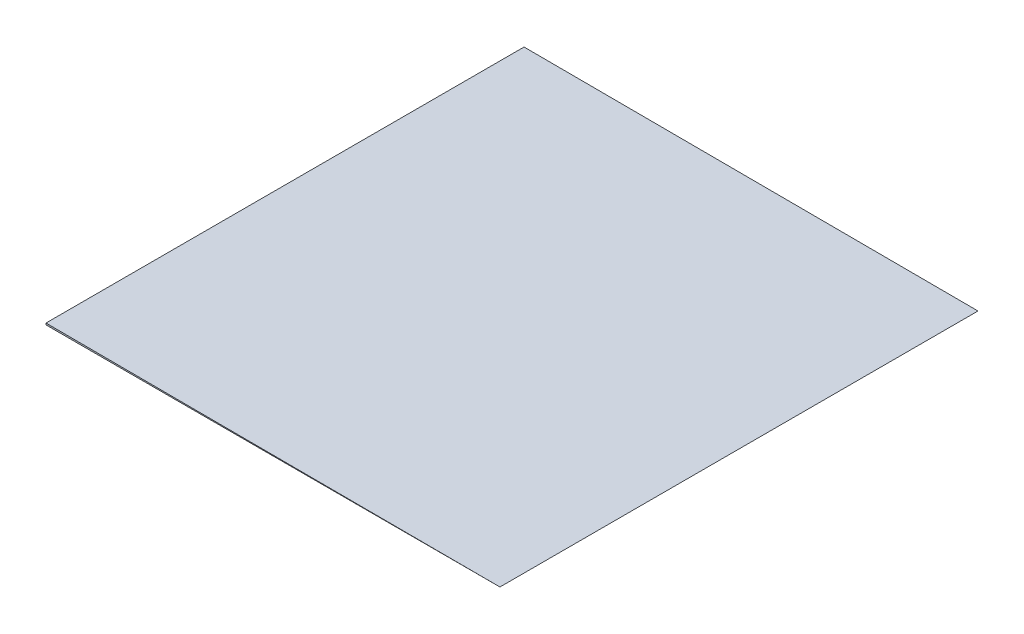
ISO-10303-21;
HEADER;
FILE_DESCRIPTION(('STEP AP214'),'2;1');
FILE_NAME('part.step','',(''),(''),'','','');
FILE_SCHEMA(('AUTOMOTIVE_DESIGN { 1 0 10303 214 1 1 1 1 }'));
ENDSEC;
DATA;
#1=APPLICATION_CONTEXT('core data for automotive mechanical design processes');
#2=APPLICATION_PROTOCOL_DEFINITION('international standard','automotive_design',2000,#1);
#3=PRODUCT_CONTEXT('',#1,'mechanical');
#4=PRODUCT('Part','Part','',(#3));
#5=PRODUCT_RELATED_PRODUCT_CATEGORY('part','',(#4));
#6=PRODUCT_DEFINITION_FORMATION('','',#4);
#7=PRODUCT_DEFINITION_CONTEXT('part definition',#1,'design');
#8=PRODUCT_DEFINITION('design','',#6,#7);
#9=PRODUCT_DEFINITION_SHAPE('','',#8);
#10=(LENGTH_UNIT() NAMED_UNIT(*) SI_UNIT(.MILLI.,.METRE.));
#11=(NAMED_UNIT(*) PLANE_ANGLE_UNIT() SI_UNIT($,.RADIAN.));
#12=(NAMED_UNIT(*) SI_UNIT($,.STERADIAN.) SOLID_ANGLE_UNIT());
#13=UNCERTAINTY_MEASURE_WITH_UNIT(LENGTH_MEASURE(1.E-05),#10,'distance_accuracy_value','');
#14=(GEOMETRIC_REPRESENTATION_CONTEXT(3) GLOBAL_UNCERTAINTY_ASSIGNED_CONTEXT((#13)) GLOBAL_UNIT_ASSIGNED_CONTEXT((#10,
#11,#12)) REPRESENTATION_CONTEXT('',''));
#15=CARTESIAN_POINT('',(0.,0.,0.));
#16=DIRECTION('',(0.,0.,1.));
#17=DIRECTION('',(1.,0.,0.));
#18=AXIS2_PLACEMENT_3D('',#15,#16,#17);
#19=CARTESIAN_POINT('',(-868.269298701879,0.,914.4));
#20=DIRECTION('',(0.,1.,0.));
#21=DIRECTION('',(0.,0.,1.));
#22=AXIS2_PLACEMENT_3D('',#19,#20,#21);
#23=PLANE('',#22);
#24=DIRECTION('',(1.,0.,0.));
#25=VECTOR('',#24,1.);
#26=CARTESIAN_POINT('',(-868.269298701879,0.,0.));
#27=LINE('',#26,#25);
#28=CARTESIAN_POINT('',(-868.269298701879,0.,0.));
#29=VERTEX_POINT('',#28);
#30=CARTESIAN_POINT('',(0.,0.,0.));
#31=VERTEX_POINT('',#30);
#32=EDGE_CURVE('E10',#29,#31,#27,.T.);
#33=ORIENTED_EDGE('',*,*,#32,.T.);
#34=DIRECTION('',(0.,0.,-1.));
#35=VECTOR('',#34,1.);
#36=CARTESIAN_POINT('',(0.,0.,914.4));
#37=LINE('',#36,#35);
#38=CARTESIAN_POINT('',(0.,0.,914.4));
#39=VERTEX_POINT('',#38);
#40=EDGE_CURVE('E35',#39,#31,#37,.T.);
#41=ORIENTED_EDGE('',*,*,#40,.F.);
#42=DIRECTION('',(1.,0.,0.));
#43=VECTOR('',#42,1.);
#44=CARTESIAN_POINT('',(-868.269298701879,0.,914.4));
#45=LINE('',#44,#43);
#46=CARTESIAN_POINT('',(-868.269298701879,0.,914.4));
#47=VERTEX_POINT('',#46);
#48=EDGE_CURVE('E56',#47,#39,#45,.T.);
#49=ORIENTED_EDGE('',*,*,#48,.F.);
#50=DIRECTION('',(0.,0.,-1.));
#51=VECTOR('',#50,1.);
#52=CARTESIAN_POINT('',(-868.269298701879,0.,914.4));
#53=LINE('',#52,#51);
#54=EDGE_CURVE('E26',#47,#29,#53,.T.);
#55=ORIENTED_EDGE('',*,*,#54,.T.);
#56=EDGE_LOOP('',(#33,#41,#49,#55));
#57=FACE_BOUND('',#56,.T.);
#58=ADVANCED_FACE('F16',(#57),#23,.F.);
#59=CARTESIAN_POINT('',(0.,0.,914.4));
#60=DIRECTION('',(-0.00365667515571453,-0.999993314341054,0.));
#61=DIRECTION('',(0.999993314341054,-0.00365667515571453,0.));
#62=AXIS2_PLACEMENT_3D('',#59,#60,#61);
#63=PLANE('',#62);
#64=DIRECTION('',(-0.999993314341054,0.00365667515571453,0.));
#65=VECTOR('',#64,1.);
#66=CARTESIAN_POINT('',(0.,0.,0.));
#67=LINE('',#66,#65);
#68=CARTESIAN_POINT('',(-868.269298701879,3.175,0.));
#69=VERTEX_POINT('',#68);
#70=EDGE_CURVE('E60',#31,#69,#67,.T.);
#71=ORIENTED_EDGE('',*,*,#70,.T.);
#72=DIRECTION('',(0.,0.,-1.));
#73=VECTOR('',#72,1.);
#74=CARTESIAN_POINT('',(-868.269298701879,3.175,914.4));
#75=LINE('',#74,#73);
#76=CARTESIAN_POINT('',(-868.269298701879,3.175,914.4));
#77=VERTEX_POINT('',#76);
#78=EDGE_CURVE('E49',#77,#69,#75,.T.);
#79=ORIENTED_EDGE('',*,*,#78,.F.);
#80=DIRECTION('',(-0.999993314341054,0.00365667515571453,0.));
#81=VECTOR('',#80,1.);
#82=CARTESIAN_POINT('',(0.,0.,914.4));
#83=LINE('',#82,#81);
#84=EDGE_CURVE('E54',#39,#77,#83,.T.);
#85=ORIENTED_EDGE('',*,*,#84,.F.);
#86=ORIENTED_EDGE('',*,*,#40,.T.);
#87=EDGE_LOOP('',(#71,#79,#85,#86));
#88=FACE_BOUND('',#87,.T.);
#89=ADVANCED_FACE('F58',(#88),#63,.F.);
#90=CARTESIAN_POINT('',(-868.269298701879,3.175,914.4));
#91=DIRECTION('',(1.,0.,0.));
#92=DIRECTION('',(0.,0.,-1.));
#93=AXIS2_PLACEMENT_3D('',#90,#91,#92);
#94=PLANE('',#93);
#95=DIRECTION('',(0.,-1.,0.));
#96=VECTOR('',#95,1.);
#97=CARTESIAN_POINT('',(-868.269298701879,3.175,0.));
#98=LINE('',#97,#96);
#99=EDGE_CURVE('E62',#69,#29,#98,.T.);
#100=ORIENTED_EDGE('',*,*,#99,.T.);
#101=ORIENTED_EDGE('',*,*,#54,.F.);
#102=DIRECTION('',(0.,-1.,0.));
#103=VECTOR('',#102,1.);
#104=CARTESIAN_POINT('',(-868.269298701879,3.175,914.4));
#105=LINE('',#104,#103);
#106=EDGE_CURVE('E20',#77,#47,#105,.T.);
#107=ORIENTED_EDGE('',*,*,#106,.F.);
#108=ORIENTED_EDGE('',*,*,#78,.T.);
#109=EDGE_LOOP('',(#100,#101,#107,#108));
#110=FACE_BOUND('',#109,.T.);
#111=ADVANCED_FACE('F65',(#110),#94,.F.);
#112=CARTESIAN_POINT('',(0.,0.,914.4));
#113=DIRECTION('',(0.,0.,-1.));
#114=DIRECTION('',(-1.,0.,0.));
#115=AXIS2_PLACEMENT_3D('',#112,#113,#114);
#116=PLANE('',#115);
#117=ORIENTED_EDGE('',*,*,#48,.T.);
#118=ORIENTED_EDGE('',*,*,#84,.T.);
#119=ORIENTED_EDGE('',*,*,#106,.T.);
#120=EDGE_LOOP('',(#117,#118,#119));
#121=FACE_BOUND('',#120,.T.);
#122=ADVANCED_FACE('F55',(#121),#116,.F.);
#123=CARTESIAN_POINT('',(0.,0.,0.));
#124=DIRECTION('',(0.,0.,-1.));
#125=DIRECTION('',(-1.,0.,0.));
#126=AXIS2_PLACEMENT_3D('',#123,#124,#125);
#127=PLANE('',#126);
#128=ORIENTED_EDGE('',*,*,#32,.F.);
#129=ORIENTED_EDGE('',*,*,#99,.F.);
#130=ORIENTED_EDGE('',*,*,#70,.F.);
#131=EDGE_LOOP('',(#128,#129,#130));
#132=FACE_BOUND('',#131,.T.);
#133=ADVANCED_FACE('F18',(#132),#127,.T.);
#134=CLOSED_SHELL('',(#58,#89,#111,#122,#133));
#135=MANIFOLD_SOLID_BREP('B1',#134);
#136=ADVANCED_BREP_SHAPE_REPRESENTATION('',(#18,#135),#14);
#137=SHAPE_DEFINITION_REPRESENTATION(#9,#136);
ENDSEC;
END-ISO-10303-21;
